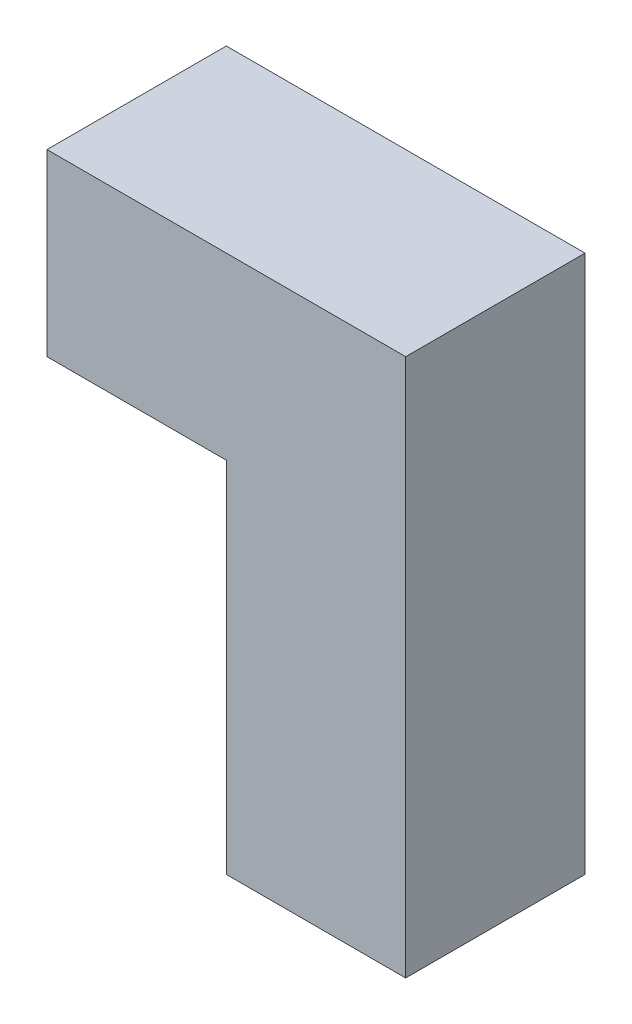
ISO-10303-21;
HEADER;
FILE_DESCRIPTION(('STEP AP214'),'2;1');
FILE_NAME('part.step','',(''),(''),'','','');
FILE_SCHEMA(('AUTOMOTIVE_DESIGN { 1 0 10303 214 1 1 1 1 }'));
ENDSEC;
DATA;
#1=APPLICATION_CONTEXT('core data for automotive mechanical design processes');
#2=APPLICATION_PROTOCOL_DEFINITION('international standard','automotive_design',2000,#1);
#3=PRODUCT_CONTEXT('',#1,'mechanical');
#4=PRODUCT('Part','Part','',(#3));
#5=PRODUCT_RELATED_PRODUCT_CATEGORY('part','',(#4));
#6=PRODUCT_DEFINITION_FORMATION('','',#4);
#7=PRODUCT_DEFINITION_CONTEXT('part definition',#1,'design');
#8=PRODUCT_DEFINITION('design','',#6,#7);
#9=PRODUCT_DEFINITION_SHAPE('','',#8);
#10=(LENGTH_UNIT() NAMED_UNIT(*) SI_UNIT(.MILLI.,.METRE.));
#11=(NAMED_UNIT(*) PLANE_ANGLE_UNIT() SI_UNIT($,.RADIAN.));
#12=(NAMED_UNIT(*) SI_UNIT($,.STERADIAN.) SOLID_ANGLE_UNIT());
#13=UNCERTAINTY_MEASURE_WITH_UNIT(LENGTH_MEASURE(1.E-05),#10,'distance_accuracy_value','');
#14=(GEOMETRIC_REPRESENTATION_CONTEXT(3) GLOBAL_UNCERTAINTY_ASSIGNED_CONTEXT((#13)) GLOBAL_UNIT_ASSIGNED_CONTEXT((#10,
#11,#12)) REPRESENTATION_CONTEXT('',''));
#15=CARTESIAN_POINT('',(0.,0.,0.));
#16=DIRECTION('',(0.,0.,1.));
#17=DIRECTION('',(1.,0.,0.));
#18=AXIS2_PLACEMENT_3D('',#15,#16,#17);
#19=CARTESIAN_POINT('',(19.05,-38.1,19.05));
#20=DIRECTION('',(-1.,0.,0.));
#21=DIRECTION('',(0.,-1.,0.));
#22=AXIS2_PLACEMENT_3D('',#19,#20,#21);
#23=PLANE('',#22);
#24=DIRECTION('',(0.,1.,0.));
#25=VECTOR('',#24,1.);
#26=CARTESIAN_POINT('',(19.05,-38.1,0.));
#27=LINE('',#26,#25);
#28=CARTESIAN_POINT('',(19.05,-38.1,0.));
#29=VERTEX_POINT('',#28);
#30=CARTESIAN_POINT('',(19.05,0.,0.));
#31=VERTEX_POINT('',#30);
#32=EDGE_CURVE('E126',#29,#31,#27,.T.);
#33=ORIENTED_EDGE('',*,*,#32,.F.);
#34=DIRECTION('',(0.,0.,-1.));
#35=VECTOR('',#34,1.);
#36=CARTESIAN_POINT('',(19.05,-38.1,19.05));
#37=LINE('',#36,#35);
#38=CARTESIAN_POINT('',(19.05,-38.1,19.05));
#39=VERTEX_POINT('',#38);
#40=EDGE_CURVE('E11',#39,#29,#37,.T.);
#41=ORIENTED_EDGE('',*,*,#40,.F.);
#42=DIRECTION('',(0.,1.,0.));
#43=VECTOR('',#42,1.);
#44=CARTESIAN_POINT('',(19.05,-38.1,19.05));
#45=LINE('',#44,#43);
#46=CARTESIAN_POINT('',(19.05,0.,19.05));
#47=VERTEX_POINT('',#46);
#48=EDGE_CURVE('E145',#39,#47,#45,.T.);
#49=ORIENTED_EDGE('',*,*,#48,.T.);
#50=DIRECTION('',(0.,0.,-1.));
#51=VECTOR('',#50,1.);
#52=CARTESIAN_POINT('',(19.05,0.,19.05));
#53=LINE('',#52,#51);
#54=EDGE_CURVE('E46',#47,#31,#53,.T.);
#55=ORIENTED_EDGE('',*,*,#54,.T.);
#56=EDGE_LOOP('',(#33,#41,#49,#55));
#57=FACE_BOUND('',#56,.T.);
#58=ADVANCED_FACE('F43',(#57),#23,.T.);
#59=CARTESIAN_POINT('',(38.1,-38.1,19.05));
#60=DIRECTION('',(0.,-1.,0.));
#61=DIRECTION('',(0.,0.,-1.));
#62=AXIS2_PLACEMENT_3D('',#59,#60,#61);
#63=PLANE('',#62);
#64=DIRECTION('',(-1.,0.,0.));
#65=VECTOR('',#64,1.);
#66=CARTESIAN_POINT('',(38.1,-38.1,0.));
#67=LINE('',#66,#65);
#68=CARTESIAN_POINT('',(38.1,-38.1,0.));
#69=VERTEX_POINT('',#68);
#70=EDGE_CURVE('E139',#69,#29,#67,.T.);
#71=ORIENTED_EDGE('',*,*,#70,.F.);
#72=DIRECTION('',(0.,0.,-1.));
#73=VECTOR('',#72,1.);
#74=CARTESIAN_POINT('',(38.1,-38.1,19.05));
#75=LINE('',#74,#73);
#76=CARTESIAN_POINT('',(38.1,-38.1,19.05));
#77=VERTEX_POINT('',#76);
#78=EDGE_CURVE('E55',#77,#69,#75,.T.);
#79=ORIENTED_EDGE('',*,*,#78,.F.);
#80=DIRECTION('',(-1.,0.,0.));
#81=VECTOR('',#80,1.);
#82=CARTESIAN_POINT('',(38.1,-38.1,19.05));
#83=LINE('',#82,#81);
#84=EDGE_CURVE('E119',#77,#39,#83,.T.);
#85=ORIENTED_EDGE('',*,*,#84,.T.);
#86=ORIENTED_EDGE('',*,*,#40,.T.);
#87=EDGE_LOOP('',(#71,#79,#85,#86));
#88=FACE_BOUND('',#87,.T.);
#89=ADVANCED_FACE('F148',(#88),#63,.T.);
#90=CARTESIAN_POINT('',(38.1,19.05,19.05));
#91=DIRECTION('',(1.,0.,0.));
#92=DIRECTION('',(0.,1.,0.));
#93=AXIS2_PLACEMENT_3D('',#90,#91,#92);
#94=PLANE('',#93);
#95=DIRECTION('',(0.,-1.,0.));
#96=VECTOR('',#95,1.);
#97=CARTESIAN_POINT('',(38.1,19.05,0.));
#98=LINE('',#97,#96);
#99=CARTESIAN_POINT('',(38.1,19.05,0.));
#100=VERTEX_POINT('',#99);
#101=EDGE_CURVE('E103',#100,#69,#98,.T.);
#102=ORIENTED_EDGE('',*,*,#101,.F.);
#103=DIRECTION('',(0.,0.,-1.));
#104=VECTOR('',#103,1.);
#105=CARTESIAN_POINT('',(38.1,19.05,19.05));
#106=LINE('',#105,#104);
#107=CARTESIAN_POINT('',(38.1,19.05,19.05));
#108=VERTEX_POINT('',#107);
#109=EDGE_CURVE('E99',#108,#100,#106,.T.);
#110=ORIENTED_EDGE('',*,*,#109,.F.);
#111=DIRECTION('',(0.,-1.,0.));
#112=VECTOR('',#111,1.);
#113=CARTESIAN_POINT('',(38.1,19.05,19.05));
#114=LINE('',#113,#112);
#115=EDGE_CURVE('E104',#108,#77,#114,.T.);
#116=ORIENTED_EDGE('',*,*,#115,.T.);
#117=ORIENTED_EDGE('',*,*,#78,.T.);
#118=EDGE_LOOP('',(#102,#110,#116,#117));
#119=FACE_BOUND('',#118,.T.);
#120=ADVANCED_FACE('F105',(#119),#94,.T.);
#121=CARTESIAN_POINT('',(0.,19.05,19.05));
#122=DIRECTION('',(0.,1.,0.));
#123=DIRECTION('',(0.,0.,1.));
#124=AXIS2_PLACEMENT_3D('',#121,#122,#123);
#125=PLANE('',#124);
#126=DIRECTION('',(1.,0.,0.));
#127=VECTOR('',#126,1.);
#128=CARTESIAN_POINT('',(0.,19.05,0.));
#129=LINE('',#128,#127);
#130=CARTESIAN_POINT('',(0.,19.05,0.));
#131=VERTEX_POINT('',#130);
#132=EDGE_CURVE('E140',#131,#100,#129,.T.);
#133=ORIENTED_EDGE('',*,*,#132,.F.);
#134=DIRECTION('',(0.,0.,-1.));
#135=VECTOR('',#134,1.);
#136=CARTESIAN_POINT('',(0.,19.05,19.05));
#137=LINE('',#136,#135);
#138=CARTESIAN_POINT('',(0.,19.05,19.05));
#139=VERTEX_POINT('',#138);
#140=EDGE_CURVE('E110',#139,#131,#137,.T.);
#141=ORIENTED_EDGE('',*,*,#140,.F.);
#142=DIRECTION('',(1.,0.,0.));
#143=VECTOR('',#142,1.);
#144=CARTESIAN_POINT('',(0.,19.05,19.05));
#145=LINE('',#144,#143);
#146=EDGE_CURVE('E116',#139,#108,#145,.T.);
#147=ORIENTED_EDGE('',*,*,#146,.T.);
#148=ORIENTED_EDGE('',*,*,#109,.T.);
#149=EDGE_LOOP('',(#133,#141,#147,#148));
#150=FACE_BOUND('',#149,.T.);
#151=ADVANCED_FACE('F120',(#150),#125,.T.);
#152=CARTESIAN_POINT('',(0.,0.,19.05));
#153=DIRECTION('',(-1.,0.,0.));
#154=DIRECTION('',(0.,0.,1.));
#155=AXIS2_PLACEMENT_3D('',#152,#153,#154);
#156=PLANE('',#155);
#157=DIRECTION('',(0.,1.,0.));
#158=VECTOR('',#157,1.);
#159=CARTESIAN_POINT('',(0.,0.,0.));
#160=LINE('',#159,#158);
#161=CARTESIAN_POINT('',(0.,0.,0.));
#162=VERTEX_POINT('',#161);
#163=EDGE_CURVE('E132',#162,#131,#160,.T.);
#164=ORIENTED_EDGE('',*,*,#163,.F.);
#165=DIRECTION('',(0.,0.,-1.));
#166=VECTOR('',#165,1.);
#167=CARTESIAN_POINT('',(0.,0.,19.05));
#168=LINE('',#167,#166);
#169=CARTESIAN_POINT('',(0.,0.,19.05));
#170=VERTEX_POINT('',#169);
#171=EDGE_CURVE('E144',#170,#162,#168,.T.);
#172=ORIENTED_EDGE('',*,*,#171,.F.);
#173=DIRECTION('',(0.,1.,0.));
#174=VECTOR('',#173,1.);
#175=CARTESIAN_POINT('',(0.,0.,19.05));
#176=LINE('',#175,#174);
#177=EDGE_CURVE('E123',#170,#139,#176,.T.);
#178=ORIENTED_EDGE('',*,*,#177,.T.);
#179=ORIENTED_EDGE('',*,*,#140,.T.);
#180=EDGE_LOOP('',(#164,#172,#178,#179));
#181=FACE_BOUND('',#180,.T.);
#182=ADVANCED_FACE('F164',(#181),#156,.T.);
#183=CARTESIAN_POINT('',(19.05,0.,19.05));
#184=DIRECTION('',(0.,-1.,0.));
#185=DIRECTION('',(1.,0.,0.));
#186=AXIS2_PLACEMENT_3D('',#183,#184,#185);
#187=PLANE('',#186);
#188=DIRECTION('',(-1.,0.,0.));
#189=VECTOR('',#188,1.);
#190=CARTESIAN_POINT('',(19.05,0.,0.));
#191=LINE('',#190,#189);
#192=EDGE_CURVE('E131',#31,#162,#191,.T.);
#193=ORIENTED_EDGE('',*,*,#192,.F.);
#194=ORIENTED_EDGE('',*,*,#54,.F.);
#195=DIRECTION('',(-1.,0.,0.));
#196=VECTOR('',#195,1.);
#197=CARTESIAN_POINT('',(19.05,0.,19.05));
#198=LINE('',#197,#196);
#199=EDGE_CURVE('E121',#47,#170,#198,.T.);
#200=ORIENTED_EDGE('',*,*,#199,.T.);
#201=ORIENTED_EDGE('',*,*,#171,.T.);
#202=EDGE_LOOP('',(#193,#194,#200,#201));
#203=FACE_BOUND('',#202,.T.);
#204=ADVANCED_FACE('F150',(#203),#187,.T.);
#205=CARTESIAN_POINT('',(0.,0.,19.05));
#206=DIRECTION('',(0.,0.,1.));
#207=DIRECTION('',(1.,0.,0.));
#208=AXIS2_PLACEMENT_3D('',#205,#206,#207);
#209=PLANE('',#208);
#210=ORIENTED_EDGE('',*,*,#48,.F.);
#211=ORIENTED_EDGE('',*,*,#84,.F.);
#212=ORIENTED_EDGE('',*,*,#115,.F.);
#213=ORIENTED_EDGE('',*,*,#146,.F.);
#214=ORIENTED_EDGE('',*,*,#177,.F.);
#215=ORIENTED_EDGE('',*,*,#199,.F.);
#216=EDGE_LOOP('',(#210,#211,#212,#213,#214,#215));
#217=FACE_BOUND('',#216,.T.);
#218=ADVANCED_FACE('F114',(#217),#209,.T.);
#219=CARTESIAN_POINT('',(0.,0.,0.));
#220=DIRECTION('',(0.,0.,1.));
#221=DIRECTION('',(1.,0.,0.));
#222=AXIS2_PLACEMENT_3D('',#219,#220,#221);
#223=PLANE('',#222);
#224=ORIENTED_EDGE('',*,*,#32,.T.);
#225=ORIENTED_EDGE('',*,*,#192,.T.);
#226=ORIENTED_EDGE('',*,*,#163,.T.);
#227=ORIENTED_EDGE('',*,*,#132,.T.);
#228=ORIENTED_EDGE('',*,*,#101,.T.);
#229=ORIENTED_EDGE('',*,*,#70,.T.);
#230=EDGE_LOOP('',(#224,#225,#226,#227,#228,#229));
#231=FACE_BOUND('',#230,.T.);
#232=ADVANCED_FACE('F146',(#231),#223,.F.);
#233=CLOSED_SHELL('',(#58,#89,#120,#151,#182,#204,#218,#232));
#234=MANIFOLD_SOLID_BREP('B2',#233);
#235=ADVANCED_BREP_SHAPE_REPRESENTATION('',(#18,#234),#14);
#236=SHAPE_DEFINITION_REPRESENTATION(#9,#235);
ENDSEC;
END-ISO-10303-21;
